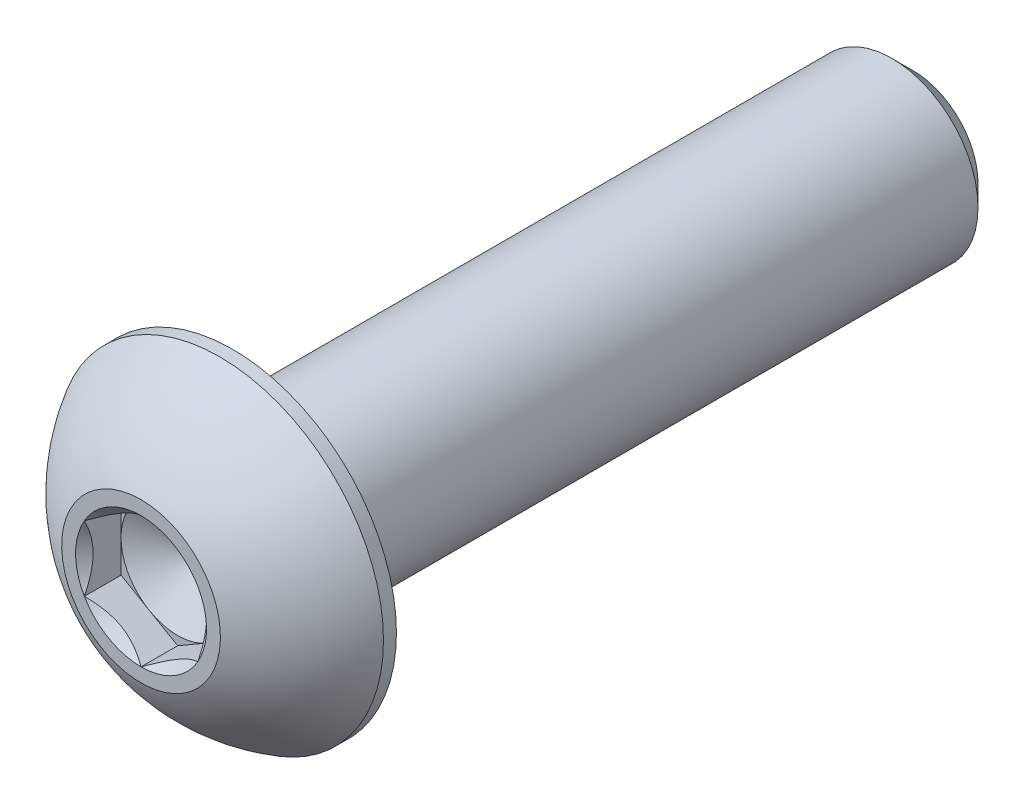
ISO-10303-21;
HEADER;
FILE_DESCRIPTION(('STEP AP214'),'2;1');
FILE_NAME('part.step','',(''),(''),'','','');
FILE_SCHEMA(('AUTOMOTIVE_DESIGN { 1 0 10303 214 1 1 1 1 }'));
ENDSEC;
DATA;
#1=APPLICATION_CONTEXT('core data for automotive mechanical design processes');
#2=APPLICATION_PROTOCOL_DEFINITION('international standard','automotive_design',2000,#1);
#3=PRODUCT_CONTEXT('',#1,'mechanical');
#4=PRODUCT('Part','Part','',(#3));
#5=PRODUCT_RELATED_PRODUCT_CATEGORY('part','',(#4));
#6=PRODUCT_DEFINITION_FORMATION('','',#4);
#7=PRODUCT_DEFINITION_CONTEXT('part definition',#1,'design');
#8=PRODUCT_DEFINITION('design','',#6,#7);
#9=PRODUCT_DEFINITION_SHAPE('','',#8);
#10=(LENGTH_UNIT() NAMED_UNIT(*) SI_UNIT(.MILLI.,.METRE.));
#11=(NAMED_UNIT(*) PLANE_ANGLE_UNIT() SI_UNIT($,.RADIAN.));
#12=(NAMED_UNIT(*) SI_UNIT($,.STERADIAN.) SOLID_ANGLE_UNIT());
#13=UNCERTAINTY_MEASURE_WITH_UNIT(LENGTH_MEASURE(1.E-05),#10,'distance_accuracy_value','');
#14=(GEOMETRIC_REPRESENTATION_CONTEXT(3) GLOBAL_UNCERTAINTY_ASSIGNED_CONTEXT((#13)) GLOBAL_UNIT_ASSIGNED_CONTEXT((#10,
#11,#12)) REPRESENTATION_CONTEXT('',''));
#15=CARTESIAN_POINT('',(0.,0.,0.));
#16=DIRECTION('',(0.,0.,1.));
#17=DIRECTION('',(1.,0.,0.));
#18=AXIS2_PLACEMENT_3D('',#15,#16,#17);
#19=CARTESIAN_POINT('',(0.,1.5875,10.8077));
#20=DIRECTION('',(0.,0.,-1.));
#21=DIRECTION('',(-1.,0.,0.));
#22=AXIS2_PLACEMENT_3D('',#19,#20,#21);
#23=PLANE('',#22);
#24=CARTESIAN_POINT('',(0.,0.,10.8077));
#25=DIRECTION('',(0.,0.,1.));
#26=DIRECTION('',(1.,0.,0.));
#27=AXIS2_PLACEMENT_3D('',#24,#25,#26);
#28=CIRCLE('',#27,2.2225);
#29=CARTESIAN_POINT('',(0.,2.2225,10.8077));
#30=VERTEX_POINT('',#29);
#31=EDGE_CURVE('E169',#30,#30,#28,.T.);
#32=ORIENTED_EDGE('',*,*,#31,.T.);
#33=EDGE_LOOP('',(#32));
#34=FACE_BOUND('',#33,.T.);
#35=CARTESIAN_POINT('',(0.,0.,10.8077));
#36=DIRECTION('',(0.,0.,1.));
#37=DIRECTION('',(1.,0.,0.));
#38=AXIS2_PLACEMENT_3D('',#35,#36,#37);
#39=CIRCLE('',#38,1.83308710467706);
#40=CARTESIAN_POINT('',(0.,1.83308710467706,10.8077));
#41=VERTEX_POINT('',#40);
#42=CARTESIAN_POINT('',(-1.5875,0.916543552338531,10.8077));
#43=VERTEX_POINT('',#42);
#44=EDGE_CURVE('E123',#41,#43,#39,.T.);
#45=ORIENTED_EDGE('',*,*,#44,.F.);
#46=CARTESIAN_POINT('',(0.,0.,10.8077));
#47=DIRECTION('',(0.,0.,1.));
#48=DIRECTION('',(1.,0.,0.));
#49=AXIS2_PLACEMENT_3D('',#46,#47,#48);
#50=CIRCLE('',#49,1.83308710467706);
#51=CARTESIAN_POINT('',(1.5875,0.916543552338531,10.8077));
#52=VERTEX_POINT('',#51);
#53=EDGE_CURVE('E108',#52,#41,#50,.T.);
#54=ORIENTED_EDGE('',*,*,#53,.F.);
#55=CARTESIAN_POINT('',(0.,0.,10.8077));
#56=DIRECTION('',(0.,0.,1.));
#57=DIRECTION('',(1.,0.,0.));
#58=AXIS2_PLACEMENT_3D('',#55,#56,#57);
#59=CIRCLE('',#58,1.83308710467706);
#60=CARTESIAN_POINT('',(1.5875,-0.916543552338531,10.8077));
#61=VERTEX_POINT('',#60);
#62=EDGE_CURVE('E119',#61,#52,#59,.T.);
#63=ORIENTED_EDGE('',*,*,#62,.F.);
#64=CARTESIAN_POINT('',(0.,0.,10.8077));
#65=DIRECTION('',(0.,0.,1.));
#66=DIRECTION('',(1.,0.,0.));
#67=AXIS2_PLACEMENT_3D('',#64,#65,#66);
#68=CIRCLE('',#67,1.83308710467706);
#69=CARTESIAN_POINT('',(0.,-1.83308710467706,10.8077));
#70=VERTEX_POINT('',#69);
#71=EDGE_CURVE('E140',#70,#61,#68,.T.);
#72=ORIENTED_EDGE('',*,*,#71,.F.);
#73=CARTESIAN_POINT('',(0.,0.,10.8077));
#74=DIRECTION('',(0.,0.,1.));
#75=DIRECTION('',(1.,0.,0.));
#76=AXIS2_PLACEMENT_3D('',#73,#74,#75);
#77=CIRCLE('',#76,1.83308710467706);
#78=CARTESIAN_POINT('',(-1.5875,-0.916543552338533,10.8077));
#79=VERTEX_POINT('',#78);
#80=EDGE_CURVE('E396',#79,#70,#77,.T.);
#81=ORIENTED_EDGE('',*,*,#80,.F.);
#82=CARTESIAN_POINT('',(0.,0.,10.8077));
#83=DIRECTION('',(0.,0.,1.));
#84=DIRECTION('',(1.,0.,0.));
#85=AXIS2_PLACEMENT_3D('',#82,#83,#84);
#86=CIRCLE('',#85,1.83308710467706);
#87=EDGE_CURVE('E405',#43,#79,#86,.T.);
#88=ORIENTED_EDGE('',*,*,#87,.F.);
#89=EDGE_LOOP('',(#45,#54,#63,#72,#81,#88));
#90=FACE_BOUND('',#89,.T.);
#91=ADVANCED_FACE('F35',(#34,#90),#23,.F.);
#92=CARTESIAN_POINT('',(0.,0.,-10.8077));
#93=DIRECTION('',(0.,0.,1.));
#94=DIRECTION('',(1.,0.,0.));
#95=AXIS2_PLACEMENT_3D('',#92,#93,#94);
#96=CONICAL_SURFACE('',#95,1.8176875,0.785398163397447);
#97=CARTESIAN_POINT('',(0.,0.,-10.2123875));
#98=DIRECTION('',(0.,0.,1.));
#99=DIRECTION('',(1.,0.,0.));
#100=AXIS2_PLACEMENT_3D('',#97,#98,#99);
#101=CIRCLE('',#100,2.413);
#102=CARTESIAN_POINT('',(2.413,0.,-10.2123875));
#103=VERTEX_POINT('',#102);
#104=EDGE_CURVE('E11',#103,#103,#101,.T.);
#105=ORIENTED_EDGE('',*,*,#104,.F.);
#106=EDGE_LOOP('',(#105));
#107=FACE_BOUND('',#106,.T.);
#108=CARTESIAN_POINT('',(0.,0.,-10.8077));
#109=DIRECTION('',(0.,0.,1.));
#110=DIRECTION('',(1.,0.,0.));
#111=AXIS2_PLACEMENT_3D('',#108,#109,#110);
#112=CIRCLE('',#111,1.8176875);
#113=CARTESIAN_POINT('',(1.8176875,0.,-10.8077));
#114=VERTEX_POINT('',#113);
#115=EDGE_CURVE('E162',#114,#114,#112,.T.);
#116=ORIENTED_EDGE('',*,*,#115,.T.);
#117=EDGE_LOOP('',(#116));
#118=FACE_BOUND('',#117,.T.);
#119=ADVANCED_FACE('F37',(#107,#118),#96,.T.);
#120=CARTESIAN_POINT('',(0.,0.,10.8077));
#121=DIRECTION('',(0.,0.,1.));
#122=DIRECTION('',(1.,0.,0.));
#123=AXIS2_PLACEMENT_3D('',#120,#121,#122);
#124=CYLINDRICAL_SURFACE('',#123,2.413);
#125=CARTESIAN_POINT('',(0.,0.,8.2423));
#126=DIRECTION('',(0.,0.,1.));
#127=DIRECTION('',(1.,0.,0.));
#128=AXIS2_PLACEMENT_3D('',#125,#126,#127);
#129=CIRCLE('',#128,2.413);
#130=CARTESIAN_POINT('',(2.413,0.,8.2423));
#131=VERTEX_POINT('',#130);
#132=EDGE_CURVE('E43',#131,#131,#129,.T.);
#133=ORIENTED_EDGE('',*,*,#132,.F.);
#134=EDGE_LOOP('',(#133));
#135=FACE_BOUND('',#134,.T.);
#136=ORIENTED_EDGE('',*,*,#104,.T.);
#137=EDGE_LOOP('',(#136));
#138=FACE_BOUND('',#137,.T.);
#139=ADVANCED_FACE('F183',(#135,#138),#124,.T.);
#140=CARTESIAN_POINT('',(0.,4.5847,8.2423));
#141=DIRECTION('',(0.,0.,1.));
#142=DIRECTION('',(1.,0.,0.));
#143=AXIS2_PLACEMENT_3D('',#140,#141,#142);
#144=PLANE('',#143);
#145=CARTESIAN_POINT('',(0.,0.,8.2423));
#146=DIRECTION('',(0.,0.,1.));
#147=DIRECTION('',(1.,0.,0.));
#148=AXIS2_PLACEMENT_3D('',#145,#146,#147);
#149=CIRCLE('',#148,4.5847);
#150=CARTESIAN_POINT('',(4.5847,0.,8.2423));
#151=VERTEX_POINT('',#150);
#152=EDGE_CURVE('E176',#151,#151,#149,.T.);
#153=ORIENTED_EDGE('',*,*,#152,.F.);
#154=EDGE_LOOP('',(#153));
#155=FACE_BOUND('',#154,.T.);
#156=ORIENTED_EDGE('',*,*,#132,.T.);
#157=EDGE_LOOP('',(#156));
#158=FACE_BOUND('',#157,.T.);
#159=ADVANCED_FACE('F181',(#155,#158),#144,.F.);
#160=CARTESIAN_POINT('',(0.,0.,10.8077));
#161=DIRECTION('',(0.,0.,1.));
#162=DIRECTION('',(1.,0.,0.));
#163=AXIS2_PLACEMENT_3D('',#160,#161,#162);
#164=CYLINDRICAL_SURFACE('',#163,4.5847);
#165=CARTESIAN_POINT('',(0.,0.,8.60515714285714));
#166=DIRECTION('',(0.,0.,1.));
#167=DIRECTION('',(1.,0.,0.));
#168=AXIS2_PLACEMENT_3D('',#165,#166,#167);
#169=CIRCLE('',#168,4.5847);
#170=CARTESIAN_POINT('',(0.,4.5847,8.60515714285714));
#171=VERTEX_POINT('',#170);
#172=EDGE_CURVE('E173',#171,#171,#169,.T.);
#173=ORIENTED_EDGE('',*,*,#172,.F.);
#174=EDGE_LOOP('',(#173));
#175=FACE_BOUND('',#174,.T.);
#176=ORIENTED_EDGE('',*,*,#152,.T.);
#177=EDGE_LOOP('',(#176));
#178=FACE_BOUND('',#177,.T.);
#179=ADVANCED_FACE('F203',(#175,#178),#164,.T.);
#180=CARTESIAN_POINT('',(0.,0.,6.0561096257943));
#181=DIRECTION('',(0.,0.,1.));
#182=DIRECTION('',(0.,1.,0.));
#183=AXIS2_PLACEMENT_3D('',#180,#181,#182);
#184=SPHERICAL_SURFACE('',#183,5.24567606074224);
#185=CARTESIAN_POINT('',(0.,2.2225,10.8077));
#186=CARTESIAN_POINT('',(0.,2.2534773813734,10.7932107482465));
#187=CARTESIAN_POINT('',(0.,2.28431303158805,10.7784184862584));
#188=CARTESIAN_POINT('',(0.,2.34568916388882,10.7482337810172));
#189=CARTESIAN_POINT('',(0.,2.37622964597494,10.7328413377641));
#190=CARTESIAN_POINT('',(0.,2.43700373620764,10.7014621091974));
#191=CARTESIAN_POINT('',(0.,2.46723734435421,10.6854753238838));
#192=CARTESIAN_POINT('',(0.,2.52738612853076,10.6529135392546));
#193=CARTESIAN_POINT('',(0.,2.55730130456074,10.636338539939));
#194=CARTESIAN_POINT('',(0.,2.61680178002346,10.6026066638777));
#195=CARTESIAN_POINT('',(0.,2.64638707945621,10.5854497871321));
#196=CARTESIAN_POINT('',(0.,2.70521648559601,10.5505607197714));
#197=CARTESIAN_POINT('',(0.,2.73446059230307,10.5328285291564));
#198=CARTESIAN_POINT('',(0.,2.7925964267897,10.496795616496));
#199=CARTESIAN_POINT('',(0.,2.82148815456926,10.4784948944507));
#200=CARTESIAN_POINT('',(0.,2.87890817994248,10.4413319191528));
#201=CARTESIAN_POINT('',(0.,2.90743647753613,10.4224696659004));
#202=CARTESIAN_POINT('',(0.,2.96411873025195,10.3841908431166));
#203=CARTESIAN_POINT('',(0.,2.99227268537412,10.3647742735852));
#204=CARTESIAN_POINT('',(0.,3.04819548406127,10.3253942452242));
#205=CARTESIAN_POINT('',(0.,3.07596432762624,10.3054307863946));
#206=CARTESIAN_POINT('',(0.,3.13110628141819,10.264964615601));
#207=CARTESIAN_POINT('',(0.,3.15847939164516,10.2444619036369));
#208=CARTESIAN_POINT('',(0.,3.21281940835191,10.2029250690077));
#209=CARTESIAN_POINT('',(0.,3.23978631483169,10.1818909463426));
#210=CARTESIAN_POINT('',(0.,3.29330360901048,10.1392993360128));
#211=CARTESIAN_POINT('',(0.,3.31985399670949,10.1177418483482));
#212=CARTESIAN_POINT('',(0.,3.37252809761461,10.0741117539117));
#213=CARTESIAN_POINT('',(0.,3.39865181082073,10.0520391471399));
#214=CARTESIAN_POINT('',(0.,3.45046257023396,10.0073872574181));
#215=CARTESIAN_POINT('',(0.,3.47614961644107,9.98480797446814));
#216=CARTESIAN_POINT('',(0.,3.52707721637841,9.93915136912649));
#217=CARTESIAN_POINT('',(0.,3.55231777010863,9.91607404673478));
#218=CARTESIAN_POINT('',(0.,3.60234273040088,9.86943018974953));
#219=CARTESIAN_POINT('',(0.,3.6271271369629,9.845863655156));
#220=CARTESIAN_POINT('',(0.,3.67623032270693,9.79825038813422));
#221=CARTESIAN_POINT('',(0.,3.70054910188895,9.77420365570597));
#222=CARTESIAN_POINT('',(0.,3.74871173076698,9.72563919106094));
#223=CARTESIAN_POINT('',(0.,3.77255558046299,9.70112145884416));
#224=CARTESIAN_POINT('',(0.,3.8197592299269,9.65162437282903));
#225=CARTESIAN_POINT('',(0.,3.8431190296948,9.62664501903068));
#226=CARTESIAN_POINT('',(0.,3.88934564401292,9.5762342446329));
#227=CARTESIAN_POINT('',(0.,3.91221245856314,9.55080282403346));
#228=CARTESIAN_POINT('',(0.,3.95744435572676,9.49949764373282));
#229=CARTESIAN_POINT('',(0.,3.97980943834017,9.47362388403161));
#230=CARTESIAN_POINT('',(0.,4.02402931682667,9.42144392242435));
#231=CARTESIAN_POINT('',(0.,4.04588411269977,9.3951377205183));
#232=CARTESIAN_POINT('',(0.,4.08907505809202,9.34210293681139));
#233=CARTESIAN_POINT('',(0.,4.11041120761118,9.31537435501054));
#234=CARTESIAN_POINT('',(0.,4.15255669906197,9.261505035384));
#235=CARTESIAN_POINT('',(0.,4.17336604099361,9.23436429755832));
#236=CARTESIAN_POINT('',(0.,4.21444995756537,9.17968104741742));
#237=CARTESIAN_POINT('',(0.,4.23472453220549,9.15213853510222));
#238=CARTESIAN_POINT('',(0.,4.27473115896065,9.09666227115159));
#239=CARTESIAN_POINT('',(0.,4.2944632110757,9.06872851951617));
#240=CARTESIAN_POINT('',(0.,4.33337724537132,9.01248046192396));
#241=CARTESIAN_POINT('',(0.,4.3525592275519,8.98416615596717));
#242=CARTESIAN_POINT('',(0.,4.39036578383499,8.92716781963255));
#243=CARTESIAN_POINT('',(0.,4.40899035793751,8.89848378925471));
#244=CARTESIAN_POINT('',(0.,4.44567497738742,8.84075697787584));
#245=CARTESIAN_POINT('',(0.,4.46373502273481,8.8117141968748));
#246=CARTESIAN_POINT('',(0.,4.49928366405765,8.75328098603411));
#247=CARTESIAN_POINT('',(0.,4.5167722600331,8.72389055619446));
#248=CARTESIAN_POINT('',(0.,4.55117135982878,8.66477331691565));
#249=CARTESIAN_POINT('',(0.,4.56808186364901,8.63504650747649));
#250=CARTESIAN_POINT('',(0.,4.5847,8.60515714285714));
#251=B_SPLINE_CURVE_WITH_KNOTS('',3,(#185,#186,#187,#188,#189,#190,#191,#192,#193,#194,#195,
#196,#197,#198,#199,#200,#201,#202,#203,#204,#205,#206,#207,#208,#209,#210,#211,#212,#213,#214,
#215,#216,#217,#218,#219,#220,#221,#222,#223,#224,#225,#226,#227,#228,#229,#230,#231,#232,#233,
#234,#235,#236,#237,#238,#239,#240,#241,#242,#243,#244,#245,#246,#247,#248,#249,#250),
.UNSPECIFIED.,.F.,.F.,(4,2,2,2,2,2,2,2,2,2,2,2,2,2,2,2,2,2,2,2,2,2,2,2,2,2,2,2,2,2,2,2,4),(0.,
0.102593825831514,0.205187651663027,0.30778147749454,0.410375303326055,0.512969129157568,
0.615562954989081,0.718156780820596,0.820750606652108,0.923344432483623,1.02593825831514,
1.12853208414665,1.23112590997816,1.33371973580968,1.43631356164119,1.5389073874727,
1.64150121330422,1.74409503913573,1.84668886496725,1.94928269079876,2.05187651663027,
2.15447034246179,2.2570641682933,2.35965799412481,2.46225181995633,2.56484564578784,
2.66743947161935,2.77003329745087,2.87262712328238,2.97522094911389,3.07781477494541,
3.18040860077692,3.28300242660844),.UNSPECIFIED.);
#252=EDGE_CURVE('BSEAM194',#30,#171,#251,.T.);
#253=ORIENTED_EDGE('',*,*,#31,.F.);
#254=ORIENTED_EDGE('',*,*,#172,.T.);
#255=ORIENTED_EDGE('',*,*,#252,.T.);
#256=ORIENTED_EDGE('',*,*,#252,.F.);
#257=EDGE_LOOP('',(#253,#255,#254,#256));
#258=FACE_BOUND('',#257,.T.);
#259=ADVANCED_FACE('F194',(#258),#184,.T.);
#260=CARTESIAN_POINT('',(0.,1.8176875,-10.8077));
#261=DIRECTION('',(0.,0.,1.));
#262=DIRECTION('',(1.,0.,0.));
#263=AXIS2_PLACEMENT_3D('',#260,#261,#262);
#264=PLANE('',#263);
#265=ORIENTED_EDGE('',*,*,#115,.F.);
#266=EDGE_LOOP('',(#265));
#267=FACE_BOUND('',#266,.T.);
#268=ADVANCED_FACE('F192',(#267),#264,.F.);
#269=CARTESIAN_POINT('',(1.5875,0.916543552338532,10.8077));
#270=DIRECTION('',(-0.499999999999999,-0.866025403784439,0.));
#271=DIRECTION('',(0.866025403784439,-0.499999999999999,0.));
#272=AXIS2_PLACEMENT_3D('',#269,#270,#271);
#273=PLANE('',#272);
#274=CARTESIAN_POINT('',(1.5877,0.916428082284694,10.8078154809637));
#275=CARTESIAN_POINT('',(1.53312479190086,0.94793709337181,10.7763308083706));
#276=CARTESIAN_POINT('',(1.47763696320971,0.979973006203396,10.7466950460135));
#277=CARTESIAN_POINT('',(1.36449087915364,1.04529792829092,10.6924322600208));
#278=CARTESIAN_POINT('',(1.30682185887062,1.07859315267522,10.6678354351332));
#279=CARTESIAN_POINT('',(1.1905349781269,1.14573141457583,10.6257003642726));
#280=CARTESIAN_POINT('',(1.13194674474407,1.17955734689075,10.6080561927298));
#281=CARTESIAN_POINT('',(1.01348022674557,1.24795402294715,10.580871470085));
#282=CARTESIAN_POINT('',(0.953605562983894,1.28252267618759,10.5713106206951));
#283=CARTESIAN_POINT('',(0.850418771876556,1.34209759781022,10.562684413104));
#284=CARTESIAN_POINT('',(0.807240015952286,1.36702686416637,10.5614071928096));
#285=CARTESIAN_POINT('',(0.720953038535397,1.41684467380557,10.5635570558147));
#286=CARTESIAN_POINT('',(0.67784484707861,1.44173319974743,10.5669857885493));
#287=CARTESIAN_POINT('',(0.592046335002029,1.49126899379091,10.5783509944333));
#288=CARTESIAN_POINT('',(0.549356408925404,1.51591603410293,10.5862913718016));
#289=CARTESIAN_POINT('',(0.464693063478356,1.56479643938728,10.6062484144511));
#290=CARTESIAN_POINT('',(0.422719959755072,1.58902962212064,10.6182668292087));
#291=CARTESIAN_POINT('',(0.315211458113564,1.65109968448354,10.6539468972472));
#292=CARTESIAN_POINT('',(0.250342771708898,1.68855163804125,10.6802985723031));
#293=CARTESIAN_POINT('',(0.154961599380923,1.74361998356043,10.7247835368517));
#294=CARTESIAN_POINT('',(0.123530699536156,1.76176662204668,10.7404128578011));
#295=CARTESIAN_POINT('',(0.061246985569636,1.79772614107138,10.7730984878611));
#296=CARTESIAN_POINT('',(0.0303939039605755,1.8155391760437,10.790154115657));
#297=CARTESIAN_POINT('',(-0.000200000000001007,1.8332025747309,10.8078154809637));
#298=B_SPLINE_CURVE_WITH_KNOTS('',3,(#274,#275,#276,#277,#278,#279,#280,#281,#282,#283,#284,
#285,#286,#287,#288,#289,#290,#291,#292,#293,#294,#295,#296,#297),.UNSPECIFIED.,.F.,.F.,(4,2,2,
2,2,2,2,2,2,2,2,4),(0.,0.211482650810817,0.424197870807277,0.633533884524816,0.842342653263349,
0.991755553727142,1.14122083674205,1.29081565918877,1.44047473906438,1.6781878086972,
1.79671410024894,1.91518409436631),.UNSPECIFIED.);
#299=EDGE_CURVE('E105',#52,#41,#298,.T.);
#300=ORIENTED_EDGE('',*,*,#299,.T.);
#301=DIRECTION('',(0.,0.,-1.));
#302=VECTOR('',#301,1.);
#303=CARTESIAN_POINT('',(0.,1.83308710467706,10.8077));
#304=LINE('',#303,#302);
#305=CARTESIAN_POINT('',(0.,1.83308710467706,9.78154));
#306=VERTEX_POINT('',#305);
#307=EDGE_CURVE('E160',#41,#306,#304,.T.);
#308=ORIENTED_EDGE('',*,*,#307,.T.);
#309=DIRECTION('',(-0.866025403784439,0.499999999999999,0.));
#310=VECTOR('',#309,1.);
#311=CARTESIAN_POINT('',(1.5875,0.916543552338532,9.78154));
#312=LINE('',#311,#310);
#313=CARTESIAN_POINT('',(0.793749999999999,1.3748153285078,9.78154));
#314=VERTEX_POINT('',#313);
#315=EDGE_CURVE('E432',#314,#306,#312,.T.);
#316=ORIENTED_EDGE('',*,*,#315,.F.);
#317=CARTESIAN_POINT('',(1.5875,0.916543552338532,9.78154));
#318=VERTEX_POINT('',#317);
#319=EDGE_CURVE('E50',#318,#314,#312,.T.);
#320=ORIENTED_EDGE('',*,*,#319,.F.);
#321=DIRECTION('',(0.,0.,-1.));
#322=VECTOR('',#321,1.);
#323=CARTESIAN_POINT('',(1.5875,0.916543552338532,10.8077));
#324=LINE('',#323,#322);
#325=EDGE_CURVE('E136',#52,#318,#324,.T.);
#326=ORIENTED_EDGE('',*,*,#325,.F.);
#327=EDGE_LOOP('',(#300,#308,#316,#320,#326));
#328=FACE_BOUND('',#327,.T.);
#329=ADVANCED_FACE('F142',(#328),#273,.T.);
#330=CARTESIAN_POINT('',(0.,1.83308710467706,10.8077));
#331=DIRECTION('',(0.500000000000001,-0.866025403784438,0.));
#332=DIRECTION('',(0.866025403784438,0.500000000000001,0.));
#333=AXIS2_PLACEMENT_3D('',#330,#331,#332);
#334=PLANE('',#333);
#335=CARTESIAN_POINT('',(0.000199999999998877,1.8332025747309,10.8078154809637));
#336=CARTESIAN_POINT('',(-0.0543752080991373,1.80169356364378,10.7763308083706));
#337=CARTESIAN_POINT('',(-0.109863036790291,1.7696576508122,10.7466950460135));
#338=CARTESIAN_POINT('',(-0.22300912084636,1.70433272872467,10.6924322600208));
#339=CARTESIAN_POINT('',(-0.280678141129382,1.67103750434037,10.6678354351332));
#340=CARTESIAN_POINT('',(-0.396965021873104,1.60389924243976,10.6257003642726));
#341=CARTESIAN_POINT('',(-0.455553255255932,1.57007331012484,10.6080561927298));
#342=CARTESIAN_POINT('',(-0.574019773254432,1.50167663406845,10.580871470085));
#343=CARTESIAN_POINT('',(-0.633894437016106,1.46710798082801,10.5713106206951));
#344=CARTESIAN_POINT('',(-0.737081228123444,1.40753305920537,10.562684413104));
#345=CARTESIAN_POINT('',(-0.780259984047714,1.38260379284922,10.5614071928096));
#346=CARTESIAN_POINT('',(-0.866546961464603,1.33278598321002,10.5635570558147));
#347=CARTESIAN_POINT('',(-0.909655152921389,1.30789745726817,10.5669857885493));
#348=CARTESIAN_POINT('',(-0.995453664997971,1.25836166322468,10.5783509944333));
#349=CARTESIAN_POINT('',(-1.03814359107459,1.23371462291266,10.5862913718016));
#350=CARTESIAN_POINT('',(-1.12280693652164,1.18483421762831,10.6062484144511));
#351=CARTESIAN_POINT('',(-1.16478004024493,1.16060103489495,10.6182668292087));
#352=CARTESIAN_POINT('',(-1.27228854188643,1.09853097253205,10.6539468972472));
#353=CARTESIAN_POINT('',(-1.3371572282911,1.06107901897434,10.6802985723031));
#354=CARTESIAN_POINT('',(-1.43253840061908,1.00601067345516,10.7247835368517));
#355=CARTESIAN_POINT('',(-1.46396930046384,0.987864034968913,10.7404128578011));
#356=CARTESIAN_POINT('',(-1.52625301443036,0.951904515944213,10.7730984878611));
#357=CARTESIAN_POINT('',(-1.55710609603942,0.934091480971893,10.790154115657));
#358=CARTESIAN_POINT('',(-1.5877,0.916428082284692,10.8078154809637));
#359=B_SPLINE_CURVE_WITH_KNOTS('',3,(#335,#336,#337,#338,#339,#340,#341,#342,#343,#344,#345,
#346,#347,#348,#349,#350,#351,#352,#353,#354,#355,#356,#357,#358),.UNSPECIFIED.,.F.,.F.,(4,2,2,
2,2,2,2,2,2,2,2,4),(0.,0.211482650810816,0.424197870807276,0.633533884524815,0.842342653263348,
0.991755553727141,1.14122083674205,1.29081565918877,1.44047473906438,1.6781878086972,
1.79671410024894,1.91518409436631),.UNSPECIFIED.);
#360=EDGE_CURVE('E420',#41,#43,#359,.T.);
#361=ORIENTED_EDGE('',*,*,#360,.T.);
#362=DIRECTION('',(0.,0.,-1.));
#363=VECTOR('',#362,1.);
#364=CARTESIAN_POINT('',(-1.5875,0.91654355233853,10.8077));
#365=LINE('',#364,#363);
#366=CARTESIAN_POINT('',(-1.5875,0.91654355233853,9.78154));
#367=VERTEX_POINT('',#366);
#368=EDGE_CURVE('E157',#43,#367,#365,.T.);
#369=ORIENTED_EDGE('',*,*,#368,.T.);
#370=DIRECTION('',(-0.866025403784438,-0.5,0.));
#371=VECTOR('',#370,1.);
#372=CARTESIAN_POINT('',(0.,1.83308710467706,9.78154));
#373=LINE('',#372,#371);
#374=CARTESIAN_POINT('',(-0.793750000000001,1.3748153285078,9.78154));
#375=VERTEX_POINT('',#374);
#376=EDGE_CURVE('E434',#375,#367,#373,.T.);
#377=ORIENTED_EDGE('',*,*,#376,.F.);
#378=EDGE_CURVE('E435',#306,#375,#373,.T.);
#379=ORIENTED_EDGE('',*,*,#378,.F.);
#380=ORIENTED_EDGE('',*,*,#307,.F.);
#381=EDGE_LOOP('',(#361,#369,#377,#379,#380));
#382=FACE_BOUND('',#381,.T.);
#383=ADVANCED_FACE('F201',(#382),#334,.T.);
#384=CARTESIAN_POINT('',(-1.5875,0.91654355233853,10.8077));
#385=DIRECTION('',(1.,0.,0.));
#386=DIRECTION('',(0.,1.,0.));
#387=AXIS2_PLACEMENT_3D('',#384,#385,#386);
#388=PLANE('',#387);
#389=CARTESIAN_POINT('',(-1.5875,-1.8064504268921,11.379486986584));
#390=CARTESIAN_POINT('',(-1.5875,-1.76236619947005,11.3463776518921));
#391=CARTESIAN_POINT('',(-1.5875,-1.7180340172246,11.3135993672874));
#392=CARTESIAN_POINT('',(-1.5875,-1.62877387436181,11.2488409272978));
#393=CARTESIAN_POINT('',(-1.5875,-1.58384576476286,11.2168609774832));
#394=CARTESIAN_POINT('',(-1.5875,-1.44736053267712,11.1218669615479));
#395=CARTESIAN_POINT('',(-1.5875,-1.3547728804759,11.0603088242448));
#396=CARTESIAN_POINT('',(-1.5875,-1.16075761948671,10.9396575197201));
#397=CARTESIAN_POINT('',(-1.5875,-1.05912459725148,10.880890844098));
#398=CARTESIAN_POINT('',(-1.5875,-0.850810108093357,10.7735306781203));
#399=CARTESIAN_POINT('',(-1.5875,-0.744147188151384,10.7249029254242));
#400=CARTESIAN_POINT('',(-1.5875,-0.583837187923046,10.6654180795062));
#401=CARTESIAN_POINT('',(-1.5875,-0.532518160842359,10.6483101147626));
#402=CARTESIAN_POINT('',(-1.5875,-0.428659985513867,10.6182170530757));
#403=CARTESIAN_POINT('',(-1.5875,-0.376120751676571,10.6052322462879));
#404=CARTESIAN_POINT('',(-1.5875,-0.271003698108569,10.5842703974627));
#405=CARTESIAN_POINT('',(-1.5875,-0.218442994151923,10.5762088512206));
#406=CARTESIAN_POINT('',(-1.5875,-0.112783135871373,10.5652474681039));
#407=CARTESIAN_POINT('',(-1.5875,-0.0596840710482705,10.5623467869566));
#408=CARTESIAN_POINT('',(-1.5875,0.0447055832560286,10.5619138193186));
#409=CARTESIAN_POINT('',(-1.5875,0.0959954901561839,10.5642001279368));
#410=CARTESIAN_POINT('',(-1.5875,0.198125185705278,10.5736197058015));
#411=CARTESIAN_POINT('',(-1.5875,0.248964929488491,10.5807534527826));
#412=CARTESIAN_POINT('',(-1.5875,0.350686556652122,10.5996031096994));
#413=CARTESIAN_POINT('',(-1.5875,0.401553911407876,10.611396261495));
#414=CARTESIAN_POINT('',(-1.5875,0.502179810539459,10.6389444375564));
#415=CARTESIAN_POINT('',(-1.5875,0.551938454553038,10.6546991042322));
#416=CARTESIAN_POINT('',(-1.5875,0.709597941546691,10.7105173760564));
#417=CARTESIAN_POINT('',(-1.5875,0.815228306930165,10.7569791563384));
#418=CARTESIAN_POINT('',(-1.5875,1.02151735170486,10.8602514550853));
#419=CARTESIAN_POINT('',(-1.5875,1.12215634479546,10.9170993580816));
#420=CARTESIAN_POINT('',(-1.5875,1.31447644029508,11.0343491247074));
#421=CARTESIAN_POINT('',(-1.5875,1.40635401847359,11.0944326845134));
#422=CARTESIAN_POINT('',(-1.5875,1.54171769329396,11.1873019080447));
#423=CARTESIAN_POINT('',(-1.5875,1.58625419266992,11.2185831278697));
#424=CARTESIAN_POINT('',(-1.5875,1.67471932537719,11.2819692036077));
#425=CARTESIAN_POINT('',(-1.5875,1.71864812234279,11.3140738308869));
#426=CARTESIAN_POINT('',(-1.5875,1.76232404534813,11.3465197844761));
#427=B_SPLINE_CURVE_WITH_KNOTS('',3,(#389,#390,#391,#392,#393,#394,#395,#396,#397,#398,#399,
#400,#401,#402,#403,#404,#405,#406,#407,#408,#409,#410,#411,#412,#413,#414,#415,#416,#417,#418,
#419,#420,#421,#422,#423,#424,#425,#426),.UNSPECIFIED.,.F.,.F.,(4,2,2,2,2,2,2,2,2,2,2,2,2,2,2,2,
2,2,4),(0.,0.165394720611769,0.330831599805599,0.664230904656281,1.01613642769877,
1.36683276443451,1.5289815746679,1.69114179313303,1.85043410106595,2.00970034776346,
2.16348276168556,2.31728033368487,2.47374234648083,2.63019024115108,2.97536284656899,
3.32180328575216,3.65097853196649,3.8142455159316,3.97746764647571),.UNSPECIFIED.);
#428=EDGE_CURVE('E413',#43,#79,#427,.F.);
#429=ORIENTED_EDGE('',*,*,#428,.T.);
#430=DIRECTION('',(0.,0.,-1.));
#431=VECTOR('',#430,1.);
#432=CARTESIAN_POINT('',(-1.5875,-0.916543552338532,10.8077));
#433=LINE('',#432,#431);
#434=CARTESIAN_POINT('',(-1.5875,-0.916543552338532,9.78154));
#435=VERTEX_POINT('',#434);
#436=EDGE_CURVE('E154',#79,#435,#433,.T.);
#437=ORIENTED_EDGE('',*,*,#436,.T.);
#438=DIRECTION('',(0.,-1.,0.));
#439=VECTOR('',#438,1.);
#440=CARTESIAN_POINT('',(-1.5875,0.91654355233853,9.78154));
#441=LINE('',#440,#439);
#442=CARTESIAN_POINT('',(-1.5875,0.,9.78154));
#443=VERTEX_POINT('',#442);
#444=EDGE_CURVE('E438',#443,#435,#441,.T.);
#445=ORIENTED_EDGE('',*,*,#444,.F.);
#446=EDGE_CURVE('E439',#367,#443,#441,.T.);
#447=ORIENTED_EDGE('',*,*,#446,.F.);
#448=ORIENTED_EDGE('',*,*,#368,.F.);
#449=EDGE_LOOP('',(#429,#437,#445,#447,#448));
#450=FACE_BOUND('',#449,.T.);
#451=ADVANCED_FACE('F256',(#450),#388,.T.);
#452=CARTESIAN_POINT('',(-1.5875,-0.916543552338532,10.8077));
#453=DIRECTION('',(0.499999999999999,0.866025403784439,0.));
#454=DIRECTION('',(-0.866025403784439,0.5,0.));
#455=AXIS2_PLACEMENT_3D('',#452,#453,#454);
#456=PLANE('',#455);
#457=CARTESIAN_POINT('',(-1.5877,-0.916428082284694,10.8078154809637));
#458=CARTESIAN_POINT('',(-1.53312479190086,-0.94793709337181,10.7763308083706));
#459=CARTESIAN_POINT('',(-1.47763696320971,-0.979973006203396,10.7466950460135));
#460=CARTESIAN_POINT('',(-1.36449087915364,-1.04529792829092,10.6924322600208));
#461=CARTESIAN_POINT('',(-1.30682185887062,-1.07859315267522,10.6678354351332));
#462=CARTESIAN_POINT('',(-1.1905349781269,-1.14573141457583,10.6257003642726));
#463=CARTESIAN_POINT('',(-1.13194674474407,-1.17955734689075,10.6080561927298));
#464=CARTESIAN_POINT('',(-1.01348022674557,-1.24795402294715,10.580871470085));
#465=CARTESIAN_POINT('',(-0.953605562983894,-1.28252267618759,10.5713106206951));
#466=CARTESIAN_POINT('',(-0.850418771876556,-1.34209759781022,10.562684413104));
#467=CARTESIAN_POINT('',(-0.807240015952286,-1.36702686416637,10.5614071928096));
#468=CARTESIAN_POINT('',(-0.720953038535397,-1.41684467380557,10.5635570558147));
#469=CARTESIAN_POINT('',(-0.67784484707861,-1.44173319974743,10.5669857885493));
#470=CARTESIAN_POINT('',(-0.592046335002028,-1.49126899379091,10.5783509944333));
#471=CARTESIAN_POINT('',(-0.549356408925404,-1.51591603410293,10.5862913718016));
#472=CARTESIAN_POINT('',(-0.464693063478356,-1.56479643938728,10.6062484144511));
#473=CARTESIAN_POINT('',(-0.422719959755072,-1.58902962212064,10.6182668292087));
#474=CARTESIAN_POINT('',(-0.315211458113564,-1.65109968448354,10.6539468972472));
#475=CARTESIAN_POINT('',(-0.250342771708898,-1.68855163804125,10.6802985723031));
#476=CARTESIAN_POINT('',(-0.154961599380923,-1.74361998356043,10.7247835368517));
#477=CARTESIAN_POINT('',(-0.123530699536155,-1.76176662204668,10.7404128578011));
#478=CARTESIAN_POINT('',(-0.0612469855696359,-1.79772614107138,10.7730984878611));
#479=CARTESIAN_POINT('',(-0.0303939039605756,-1.8155391760437,10.790154115657));
#480=CARTESIAN_POINT('',(0.000200000000001007,-1.8332025747309,10.8078154809637));
#481=B_SPLINE_CURVE_WITH_KNOTS('',3,(#457,#458,#459,#460,#461,#462,#463,#464,#465,#466,#467,
#468,#469,#470,#471,#472,#473,#474,#475,#476,#477,#478,#479,#480),.UNSPECIFIED.,.F.,.F.,(4,2,2,
2,2,2,2,2,2,2,2,4),(0.,0.211482650810816,0.424197870807276,0.633533884524816,0.842342653263349,
0.991755553727142,1.14122083674205,1.29081565918877,1.44047473906438,1.6781878086972,
1.79671410024894,1.91518409436631),.UNSPECIFIED.);
#482=EDGE_CURVE('E398',#79,#70,#481,.T.);
#483=ORIENTED_EDGE('',*,*,#482,.T.);
#484=DIRECTION('',(0.,0.,-1.));
#485=VECTOR('',#484,1.);
#486=CARTESIAN_POINT('',(0.,-1.83308710467706,10.8077));
#487=LINE('',#486,#485);
#488=CARTESIAN_POINT('',(0.,-1.83308710467706,9.78154));
#489=VERTEX_POINT('',#488);
#490=EDGE_CURVE('E145',#70,#489,#487,.T.);
#491=ORIENTED_EDGE('',*,*,#490,.T.);
#492=DIRECTION('',(0.866025403784439,-0.499999999999999,0.));
#493=VECTOR('',#492,1.);
#494=CARTESIAN_POINT('',(-1.5875,-0.916543552338532,9.78154));
#495=LINE('',#494,#493);
#496=CARTESIAN_POINT('',(-0.793749999999999,-1.3748153285078,9.78154));
#497=VERTEX_POINT('',#496);
#498=EDGE_CURVE('E442',#497,#489,#495,.T.);
#499=ORIENTED_EDGE('',*,*,#498,.F.);
#500=EDGE_CURVE('E443',#435,#497,#495,.T.);
#501=ORIENTED_EDGE('',*,*,#500,.F.);
#502=ORIENTED_EDGE('',*,*,#436,.F.);
#503=EDGE_LOOP('',(#483,#491,#499,#501,#502));
#504=FACE_BOUND('',#503,.T.);
#505=ADVANCED_FACE('F264',(#504),#456,.T.);
#506=CARTESIAN_POINT('',(0.,-1.83308710467706,10.8077));
#507=DIRECTION('',(-0.5,0.866025403784438,0.));
#508=DIRECTION('',(-0.866025403784439,-0.5,0.));
#509=AXIS2_PLACEMENT_3D('',#506,#507,#508);
#510=PLANE('',#509);
#511=CARTESIAN_POINT('',(-0.000199999999998767,-1.8332025747309,10.8078154809637));
#512=CARTESIAN_POINT('',(0.0543752080991374,-1.80169356364378,10.7763308083706));
#513=CARTESIAN_POINT('',(0.109863036790291,-1.7696576508122,10.7466950460135));
#514=CARTESIAN_POINT('',(0.22300912084636,-1.70433272872467,10.6924322600208));
#515=CARTESIAN_POINT('',(0.280678141129382,-1.67103750434037,10.6678354351332));
#516=CARTESIAN_POINT('',(0.396965021873104,-1.60389924243976,10.6257003642726));
#517=CARTESIAN_POINT('',(0.455553255255931,-1.57007331012484,10.6080561927298));
#518=CARTESIAN_POINT('',(0.574019773254431,-1.50167663406845,10.580871470085));
#519=CARTESIAN_POINT('',(0.633894437016105,-1.46710798082801,10.5713106206951));
#520=CARTESIAN_POINT('',(0.737081228123442,-1.40753305920537,10.562684413104));
#521=CARTESIAN_POINT('',(0.780259984047712,-1.38260379284922,10.5614071928096));
#522=CARTESIAN_POINT('',(0.866546961464601,-1.33278598321002,10.5635570558147));
#523=CARTESIAN_POINT('',(0.909655152921388,-1.30789745726817,10.5669857885493));
#524=CARTESIAN_POINT('',(0.995453664997969,-1.25836166322469,10.5783509944333));
#525=CARTESIAN_POINT('',(1.03814359107459,-1.23371462291266,10.5862913718016));
#526=CARTESIAN_POINT('',(1.12280693652164,-1.18483421762831,10.6062484144511));
#527=CARTESIAN_POINT('',(1.16478004024493,-1.16060103489495,10.6182668292087));
#528=CARTESIAN_POINT('',(1.27228854188643,-1.09853097253205,10.6539468972472));
#529=CARTESIAN_POINT('',(1.3371572282911,-1.06107901897434,10.6802985723031));
#530=CARTESIAN_POINT('',(1.43253840061908,-1.00601067345516,10.7247835368517));
#531=CARTESIAN_POINT('',(1.46396930046384,-0.987864034968914,10.7404128578011));
#532=CARTESIAN_POINT('',(1.52625301443036,-0.951904515944214,10.7730984878611));
#533=CARTESIAN_POINT('',(1.55710609603942,-0.934091480971894,10.790154115657));
#534=CARTESIAN_POINT('',(1.5877,-0.916428082284693,10.8078154809637));
#535=B_SPLINE_CURVE_WITH_KNOTS('',3,(#511,#512,#513,#514,#515,#516,#517,#518,#519,#520,#521,
#522,#523,#524,#525,#526,#527,#528,#529,#530,#531,#532,#533,#534),.UNSPECIFIED.,.F.,.F.,(4,2,2,
2,2,2,2,2,2,2,2,4),(0.,0.211482650810816,0.424197870807275,0.633533884524814,0.842342653263346,
0.99175555372714,1.14122083674204,1.29081565918877,1.44047473906437,1.6781878086972,
1.79671410024894,1.91518409436631),.UNSPECIFIED.);
#536=EDGE_CURVE('E389',#70,#61,#535,.T.);
#537=ORIENTED_EDGE('',*,*,#536,.T.);
#538=DIRECTION('',(0.,0.,-1.));
#539=VECTOR('',#538,1.);
#540=CARTESIAN_POINT('',(1.5875,-0.916543552338531,10.8077));
#541=LINE('',#540,#539);
#542=CARTESIAN_POINT('',(1.5875,-0.916543552338531,9.78154));
#543=VERTEX_POINT('',#542);
#544=EDGE_CURVE('E139',#61,#543,#541,.T.);
#545=ORIENTED_EDGE('',*,*,#544,.T.);
#546=DIRECTION('',(0.866025403784438,0.5,0.));
#547=VECTOR('',#546,1.);
#548=CARTESIAN_POINT('',(0.,-1.83308710467706,9.78154));
#549=LINE('',#548,#547);
#550=CARTESIAN_POINT('',(0.793750000000001,-1.3748153285078,9.78154));
#551=VERTEX_POINT('',#550);
#552=EDGE_CURVE('E445',#551,#543,#549,.T.);
#553=ORIENTED_EDGE('',*,*,#552,.F.);
#554=EDGE_CURVE('E446',#489,#551,#549,.T.);
#555=ORIENTED_EDGE('',*,*,#554,.F.);
#556=ORIENTED_EDGE('',*,*,#490,.F.);
#557=EDGE_LOOP('',(#537,#545,#553,#555,#556));
#558=FACE_BOUND('',#557,.T.);
#559=ADVANCED_FACE('F272',(#558),#510,.T.);
#560=CARTESIAN_POINT('',(1.5875,-0.916543552338531,10.8077));
#561=DIRECTION('',(-1.,0.,0.));
#562=DIRECTION('',(0.,-1.,0.));
#563=AXIS2_PLACEMENT_3D('',#560,#561,#562);
#564=PLANE('',#563);
#565=CARTESIAN_POINT('',(1.5875,-1.8064504268921,11.379486986584));
#566=CARTESIAN_POINT('',(1.5875,-1.76236619947005,11.3463776518921));
#567=CARTESIAN_POINT('',(1.5875,-1.7180340172246,11.3135993672874));
#568=CARTESIAN_POINT('',(1.5875,-1.62877387436181,11.2488409272978));
#569=CARTESIAN_POINT('',(1.5875,-1.58384576476286,11.2168609774832));
#570=CARTESIAN_POINT('',(1.5875,-1.44736053267712,11.1218669615479));
#571=CARTESIAN_POINT('',(1.5875,-1.3547728804759,11.0603088242448));
#572=CARTESIAN_POINT('',(1.5875,-1.16075761948671,10.9396575197201));
#573=CARTESIAN_POINT('',(1.5875,-1.05912459725148,10.880890844098));
#574=CARTESIAN_POINT('',(1.5875,-0.850810108093356,10.7735306781203));
#575=CARTESIAN_POINT('',(1.5875,-0.744147188151383,10.7249029254242));
#576=CARTESIAN_POINT('',(1.5875,-0.583837187923044,10.6654180795062));
#577=CARTESIAN_POINT('',(1.5875,-0.532518160842358,10.6483101147626));
#578=CARTESIAN_POINT('',(1.5875,-0.428659985513866,10.6182170530757));
#579=CARTESIAN_POINT('',(1.5875,-0.376120751676569,10.6052322462879));
#580=CARTESIAN_POINT('',(1.5875,-0.271003698108567,10.5842703974627));
#581=CARTESIAN_POINT('',(1.5875,-0.218442994151921,10.5762088512206));
#582=CARTESIAN_POINT('',(1.5875,-0.112783135871372,10.5652474681039));
#583=CARTESIAN_POINT('',(1.5875,-0.0596840710482697,10.5623467869566));
#584=CARTESIAN_POINT('',(1.5875,0.0447055832560297,10.5619138193186));
#585=CARTESIAN_POINT('',(1.5875,0.0959954901561851,10.5642001279368));
#586=CARTESIAN_POINT('',(1.5875,0.198125185705279,10.5736197058015));
#587=CARTESIAN_POINT('',(1.5875,0.248964929488491,10.5807534527826));
#588=CARTESIAN_POINT('',(1.5875,0.350686556652122,10.5996031096994));
#589=CARTESIAN_POINT('',(1.5875,0.401553911407877,10.611396261495));
#590=CARTESIAN_POINT('',(1.5875,0.50217981053946,10.6389444375564));
#591=CARTESIAN_POINT('',(1.5875,0.551938454553039,10.6546991042322));
#592=CARTESIAN_POINT('',(1.5875,0.709597941546692,10.7105173760564));
#593=CARTESIAN_POINT('',(1.5875,0.815228306930167,10.7569791563384));
#594=CARTESIAN_POINT('',(1.5875,1.02151735170486,10.8602514550853));
#595=CARTESIAN_POINT('',(1.5875,1.12215634479547,10.9170993580816));
#596=CARTESIAN_POINT('',(1.5875,1.31447644029508,11.0343491247074));
#597=CARTESIAN_POINT('',(1.5875,1.40635401847359,11.0944326845134));
#598=CARTESIAN_POINT('',(1.5875,1.54171769329396,11.1873019080447));
#599=CARTESIAN_POINT('',(1.5875,1.58625419266992,11.2185831278697));
#600=CARTESIAN_POINT('',(1.5875,1.67471932537719,11.2819692036077));
#601=CARTESIAN_POINT('',(1.5875,1.71864812234279,11.3140738308869));
#602=CARTESIAN_POINT('',(1.5875,1.76232404534813,11.3465197844761));
#603=B_SPLINE_CURVE_WITH_KNOTS('',3,(#565,#566,#567,#568,#569,#570,#571,#572,#573,#574,#575,
#576,#577,#578,#579,#580,#581,#582,#583,#584,#585,#586,#587,#588,#589,#590,#591,#592,#593,#594,
#595,#596,#597,#598,#599,#600,#601,#602),.UNSPECIFIED.,.F.,.F.,(4,2,2,2,2,2,2,2,2,2,2,2,2,2,2,2,
2,2,4),(0.,0.165394720611769,0.330831599805599,0.66423090465628,1.01613642769877,
1.36683276443451,1.5289815746679,1.69114179313303,1.85043410106595,2.00970034776347,
2.16348276168557,2.31728033368487,2.47374234648083,2.63019024115108,2.97536284656899,
3.32180328575217,3.65097853196649,3.8142455159316,3.97746764647571),.UNSPECIFIED.);
#604=EDGE_CURVE('E129',#61,#52,#603,.T.);
#605=ORIENTED_EDGE('',*,*,#604,.T.);
#606=ORIENTED_EDGE('',*,*,#325,.T.);
#607=DIRECTION('',(0.,1.,0.));
#608=VECTOR('',#607,1.);
#609=CARTESIAN_POINT('',(1.5875,-0.916543552338531,9.78154));
#610=LINE('',#609,#608);
#611=CARTESIAN_POINT('',(1.5875,0.,9.78154));
#612=VERTEX_POINT('',#611);
#613=EDGE_CURVE('E148',#612,#318,#610,.T.);
#614=ORIENTED_EDGE('',*,*,#613,.F.);
#615=EDGE_CURVE('E143',#543,#612,#610,.T.);
#616=ORIENTED_EDGE('',*,*,#615,.F.);
#617=ORIENTED_EDGE('',*,*,#544,.F.);
#618=EDGE_LOOP('',(#605,#606,#614,#616,#617));
#619=FACE_BOUND('',#618,.T.);
#620=ADVANCED_FACE('F134',(#619),#564,.T.);
#621=CARTESIAN_POINT('',(0.,0.,9.78154));
#622=DIRECTION('',(0.,0.,1.));
#623=DIRECTION('',(1.,0.,0.));
#624=AXIS2_PLACEMENT_3D('',#621,#622,#623);
#625=PLANE('',#624);
#626=CARTESIAN_POINT('',(0.,0.,9.78154));
#627=DIRECTION('',(0.,0.,1.));
#628=DIRECTION('',(1.,0.,0.));
#629=AXIS2_PLACEMENT_3D('',#626,#627,#628);
#630=CIRCLE('',#629,1.5875);
#631=EDGE_CURVE('E165',#551,#612,#630,.T.);
#632=ORIENTED_EDGE('',*,*,#631,.F.);
#633=ORIENTED_EDGE('',*,*,#552,.T.);
#634=ORIENTED_EDGE('',*,*,#615,.T.);
#635=EDGE_LOOP('',(#632,#633,#634));
#636=FACE_BOUND('',#635,.T.);
#637=ADVANCED_FACE('F287',(#636),#625,.T.);
#638=EDGE_CURVE('E458',#497,#551,#630,.T.);
#639=ORIENTED_EDGE('',*,*,#638,.F.);
#640=ORIENTED_EDGE('',*,*,#498,.T.);
#641=ORIENTED_EDGE('',*,*,#554,.T.);
#642=EDGE_LOOP('',(#639,#640,#641));
#643=FACE_BOUND('',#642,.T.);
#644=ADVANCED_FACE('F294',(#643),#625,.T.);
#645=EDGE_CURVE('E459',#443,#497,#630,.T.);
#646=ORIENTED_EDGE('',*,*,#645,.F.);
#647=ORIENTED_EDGE('',*,*,#444,.T.);
#648=ORIENTED_EDGE('',*,*,#500,.T.);
#649=EDGE_LOOP('',(#646,#647,#648));
#650=FACE_BOUND('',#649,.T.);
#651=ADVANCED_FACE('F302',(#650),#625,.T.);
#652=EDGE_CURVE('E460',#375,#443,#630,.T.);
#653=ORIENTED_EDGE('',*,*,#652,.F.);
#654=ORIENTED_EDGE('',*,*,#376,.T.);
#655=ORIENTED_EDGE('',*,*,#446,.T.);
#656=EDGE_LOOP('',(#653,#654,#655));
#657=FACE_BOUND('',#656,.T.);
#658=ADVANCED_FACE('F309',(#657),#625,.T.);
#659=EDGE_CURVE('E170',#314,#375,#630,.T.);
#660=ORIENTED_EDGE('',*,*,#659,.F.);
#661=ORIENTED_EDGE('',*,*,#315,.T.);
#662=ORIENTED_EDGE('',*,*,#378,.T.);
#663=EDGE_LOOP('',(#660,#661,#662));
#664=FACE_BOUND('',#663,.T.);
#665=ADVANCED_FACE('F316',(#664),#625,.T.);
#666=EDGE_CURVE('E166',#612,#314,#630,.T.);
#667=ORIENTED_EDGE('',*,*,#666,.F.);
#668=ORIENTED_EDGE('',*,*,#613,.T.);
#669=ORIENTED_EDGE('',*,*,#319,.T.);
#670=EDGE_LOOP('',(#667,#668,#669));
#671=FACE_BOUND('',#670,.T.);
#672=ADVANCED_FACE('F240',(#671),#625,.T.);
#673=CARTESIAN_POINT('',(0.,0.,9.78154));
#674=DIRECTION('',(0.,0.,1.));
#675=DIRECTION('',(1.,0.,0.));
#676=AXIS2_PLACEMENT_3D('',#673,#674,#675);
#677=CONICAL_SURFACE('',#676,1.5875,1.0471975511966);
#678=CARTESIAN_POINT('',(0.,0.,8.86499644766147));
#679=VERTEX_POINT('',#678);
#680=VERTEX_LOOP('',#679);
#681=FACE_BOUND('',#680,.T.);
#682=ORIENTED_EDGE('',*,*,#666,.T.);
#683=ORIENTED_EDGE('',*,*,#659,.T.);
#684=ORIENTED_EDGE('',*,*,#652,.T.);
#685=ORIENTED_EDGE('',*,*,#645,.T.);
#686=ORIENTED_EDGE('',*,*,#638,.T.);
#687=ORIENTED_EDGE('',*,*,#631,.T.);
#688=EDGE_LOOP('',(#682,#683,#684,#685,#686,#687));
#689=FACE_BOUND('',#688,.T.);
#690=ADVANCED_FACE('F213',(#681,#689),#677,.F.);
#691=CARTESIAN_POINT('',(0.,0.,10.8077));
#692=DIRECTION('',(0.,0.,1.));
#693=DIRECTION('',(1.,0.,0.));
#694=AXIS2_PLACEMENT_3D('',#691,#692,#693);
#695=CONICAL_SURFACE('',#694,1.83308710467706,0.78539816339745);
#696=ORIENTED_EDGE('',*,*,#44,.T.);
#697=ORIENTED_EDGE('',*,*,#360,.F.);
#698=EDGE_LOOP('',(#696,#697));
#699=FACE_BOUND('',#698,.T.);
#700=ADVANCED_FACE('F239',(#699),#695,.F.);
#701=CARTESIAN_POINT('',(0.,0.,10.8077));
#702=DIRECTION('',(0.,0.,1.));
#703=DIRECTION('',(1.,0.,0.));
#704=AXIS2_PLACEMENT_3D('',#701,#702,#703);
#705=CONICAL_SURFACE('',#704,1.83308710467706,0.78539816339745);
#706=ORIENTED_EDGE('',*,*,#87,.T.);
#707=ORIENTED_EDGE('',*,*,#428,.F.);
#708=EDGE_LOOP('',(#706,#707));
#709=FACE_BOUND('',#708,.T.);
#710=ADVANCED_FACE('F332',(#709),#705,.F.);
#711=CARTESIAN_POINT('',(0.,0.,10.8077));
#712=DIRECTION('',(0.,0.,1.));
#713=DIRECTION('',(1.,0.,0.));
#714=AXIS2_PLACEMENT_3D('',#711,#712,#713);
#715=CONICAL_SURFACE('',#714,1.83308710467706,0.78539816339745);
#716=ORIENTED_EDGE('',*,*,#80,.T.);
#717=ORIENTED_EDGE('',*,*,#482,.F.);
#718=EDGE_LOOP('',(#716,#717));
#719=FACE_BOUND('',#718,.T.);
#720=ADVANCED_FACE('F340',(#719),#715,.F.);
#721=CARTESIAN_POINT('',(0.,0.,10.8077));
#722=DIRECTION('',(0.,0.,1.));
#723=DIRECTION('',(1.,0.,0.));
#724=AXIS2_PLACEMENT_3D('',#721,#722,#723);
#725=CONICAL_SURFACE('',#724,1.83308710467706,0.78539816339745);
#726=ORIENTED_EDGE('',*,*,#71,.T.);
#727=ORIENTED_EDGE('',*,*,#536,.F.);
#728=EDGE_LOOP('',(#726,#727));
#729=FACE_BOUND('',#728,.T.);
#730=ADVANCED_FACE('F348',(#729),#725,.F.);
#731=CARTESIAN_POINT('',(0.,0.,10.8077));
#732=DIRECTION('',(0.,0.,1.));
#733=DIRECTION('',(1.,0.,0.));
#734=AXIS2_PLACEMENT_3D('',#731,#732,#733);
#735=CONICAL_SURFACE('',#734,1.83308710467706,0.78539816339745);
#736=ORIENTED_EDGE('',*,*,#62,.T.);
#737=ORIENTED_EDGE('',*,*,#604,.F.);
#738=EDGE_LOOP('',(#736,#737));
#739=FACE_BOUND('',#738,.T.);
#740=ADVANCED_FACE('F128',(#739),#735,.F.);
#741=CARTESIAN_POINT('',(0.,0.,10.8077));
#742=DIRECTION('',(0.,0.,1.));
#743=DIRECTION('',(1.,0.,0.));
#744=AXIS2_PLACEMENT_3D('',#741,#742,#743);
#745=CONICAL_SURFACE('',#744,1.83308710467706,0.78539816339745);
#746=ORIENTED_EDGE('',*,*,#53,.T.);
#747=ORIENTED_EDGE('',*,*,#299,.F.);
#748=EDGE_LOOP('',(#746,#747));
#749=FACE_BOUND('',#748,.T.);
#750=ADVANCED_FACE('F107',(#749),#745,.F.);
#751=CLOSED_SHELL('',(#91,#119,#139,#159,#179,#259,#268,#329,#383,#451,#505,#559,#620,#637,#644,
#651,#658,#665,#672,#690,#700,#710,#720,#730,#740,#750));
#752=MANIFOLD_SOLID_BREP('B2',#751);
#753=ADVANCED_BREP_SHAPE_REPRESENTATION('',(#18,#752),#14);
#754=SHAPE_DEFINITION_REPRESENTATION(#9,#753);
ENDSEC;
END-ISO-10303-21;
